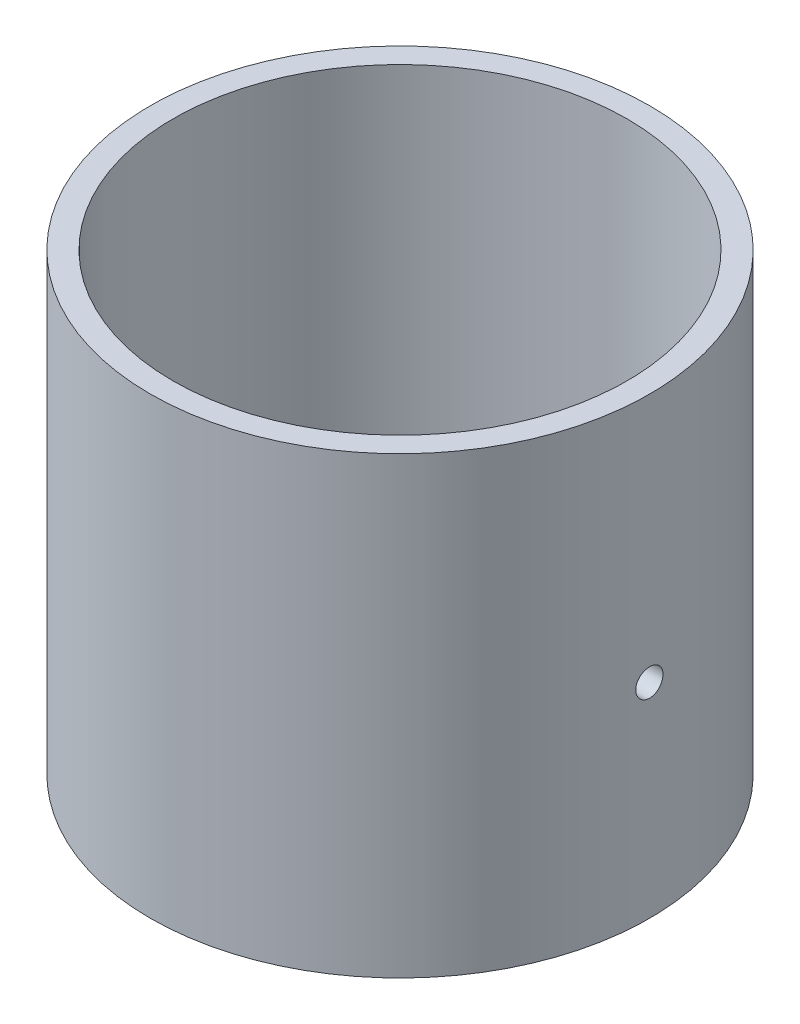
ISO-10303-21;
HEADER;
FILE_DESCRIPTION(('STEP AP214'),'2;1');
FILE_NAME('part.step','',(''),(''),'','','');
FILE_SCHEMA(('AUTOMOTIVE_DESIGN { 1 0 10303 214 1 1 1 1 }'));
ENDSEC;
DATA;
#1=APPLICATION_CONTEXT('core data for automotive mechanical design processes');
#2=APPLICATION_PROTOCOL_DEFINITION('international standard','automotive_design',2000,#1);
#3=PRODUCT_CONTEXT('',#1,'mechanical');
#4=PRODUCT('Part','Part','',(#3));
#5=PRODUCT_RELATED_PRODUCT_CATEGORY('part','',(#4));
#6=PRODUCT_DEFINITION_FORMATION('','',#4);
#7=PRODUCT_DEFINITION_CONTEXT('part definition',#1,'design');
#8=PRODUCT_DEFINITION('design','',#6,#7);
#9=PRODUCT_DEFINITION_SHAPE('','',#8);
#10=(LENGTH_UNIT() NAMED_UNIT(*) SI_UNIT(.MILLI.,.METRE.));
#11=(NAMED_UNIT(*) PLANE_ANGLE_UNIT() SI_UNIT($,.RADIAN.));
#12=(NAMED_UNIT(*) SI_UNIT($,.STERADIAN.) SOLID_ANGLE_UNIT());
#13=UNCERTAINTY_MEASURE_WITH_UNIT(LENGTH_MEASURE(1.E-05),#10,'distance_accuracy_value','');
#14=(GEOMETRIC_REPRESENTATION_CONTEXT(3) GLOBAL_UNCERTAINTY_ASSIGNED_CONTEXT((#13)) GLOBAL_UNIT_ASSIGNED_CONTEXT((#10,
#11,#12)) REPRESENTATION_CONTEXT('',''));
#15=CARTESIAN_POINT('',(0.,0.,0.));
#16=DIRECTION('',(0.,0.,1.));
#17=DIRECTION('',(1.,0.,0.));
#18=AXIS2_PLACEMENT_3D('',#15,#16,#17);
#19=CARTESIAN_POINT('',(17.2756766467066,79.0743076923077,0.));
#20=DIRECTION('',(0.,-1.,0.));
#21=DIRECTION('',(0.,0.,-1.));
#22=AXIS2_PLACEMENT_3D('',#19,#20,#21);
#23=PLANE('',#22);
#24=CARTESIAN_POINT('',(17.2756766467066,79.0743076923077,0.));
#25=DIRECTION('',(0.,1.,0.));
#26=DIRECTION('',(0.,0.,1.));
#27=AXIS2_PLACEMENT_3D('',#24,#25,#26);
#28=CIRCLE('',#27,50.);
#29=CARTESIAN_POINT('',(17.2756766467066,79.0743076923077,50.));
#30=VERTEX_POINT('',#29);
#31=EDGE_CURVE('E57',#30,#30,#28,.T.);
#32=ORIENTED_EDGE('',*,*,#31,.F.);
#33=EDGE_LOOP('',(#32));
#34=FACE_BOUND('',#33,.T.);
#35=CARTESIAN_POINT('',(17.2756766467066,79.0743076923077,0.));
#36=DIRECTION('',(0.,-1.,0.));
#37=DIRECTION('',(0.,0.,-1.));
#38=AXIS2_PLACEMENT_3D('',#35,#36,#37);
#39=CIRCLE('',#38,55.);
#40=CARTESIAN_POINT('',(17.2756766467066,79.0743076923077,-55.));
#41=VERTEX_POINT('',#40);
#42=EDGE_CURVE('E10',#41,#41,#39,.T.);
#43=ORIENTED_EDGE('',*,*,#42,.F.);
#44=EDGE_LOOP('',(#43));
#45=FACE_BOUND('',#44,.T.);
#46=ADVANCED_FACE('F40',(#34,#45),#23,.F.);
#47=CARTESIAN_POINT('',(17.2756766467066,-20.9256923076923,0.));
#48=DIRECTION('',(0.,-1.,0.));
#49=DIRECTION('',(0.,0.,-1.));
#50=AXIS2_PLACEMENT_3D('',#47,#48,#49);
#51=CYLINDRICAL_SURFACE('',#50,55.);
#52=CARTESIAN_POINT('',(72.1937975176905,24.0743076923077,-3.));
#53=CARTESIAN_POINT('',(72.1937986160789,23.9059309109595,-2.99999257620985));
#54=CARTESIAN_POINT('',(72.1945801969636,23.7374352315981,-2.98577701071855));
#55=CARTESIAN_POINT('',(72.1976225574519,23.4050935633971,-2.92927073924333));
#56=CARTESIAN_POINT('',(72.1998850727335,23.2412532661284,-2.8869470892997));
#57=CARTESIAN_POINT('',(72.2056322610726,22.9230846640937,-2.77544136472266));
#58=CARTESIAN_POINT('',(72.2091163035504,22.7687514997691,-2.70627314589127));
#59=CARTESIAN_POINT('',(72.2169131716819,22.4739275400449,-2.54306337972707));
#60=CARTESIAN_POINT('',(72.2212258036204,22.3334335207955,-2.44902764421664));
#61=CARTESIAN_POINT('',(72.2301996893931,22.0700691070461,-2.23862960286198));
#62=CARTESIAN_POINT('',(72.2348612992398,21.947217093408,-2.1222443022169));
#63=CARTESIAN_POINT('',(72.244004534305,21.7227809558415,-1.87049745795912));
#64=CARTESIAN_POINT('',(72.2484861521167,21.6211977064113,-1.73513513445859));
#65=CARTESIAN_POINT('',(72.2567672632636,21.4421298720307,-1.4491776545403));
#66=CARTESIAN_POINT('',(72.260566341499,21.3646599312199,-1.29857331484201));
#67=CARTESIAN_POINT('',(72.2670506197092,21.2361116990724,-0.986471471945922));
#68=CARTESIAN_POINT('',(72.2697358292931,21.1850331800618,-0.824974062734187));
#69=CARTESIAN_POINT('',(72.2736873773289,21.1107671754883,-0.49584245153538));
#70=CARTESIAN_POINT('',(72.2749551389176,21.0875517133229,-0.328214579607726));
#71=CARTESIAN_POINT('',(72.2759337129707,21.0695844649505,0.00856333218424759));
#72=CARTESIAN_POINT('',(72.2756445394788,21.0748324220033,0.177713358304984));
#73=CARTESIAN_POINT('',(72.2735430235174,21.1136198761938,0.512544575084419));
#74=CARTESIAN_POINT('',(72.2717323018887,21.1471292677653,0.678229264807286));
#75=CARTESIAN_POINT('',(72.2667934787066,21.2414416967431,1.00161843019289));
#76=CARTESIAN_POINT('',(72.2636653708602,21.3022448645332,1.15932286772952));
#77=CARTESIAN_POINT('',(72.2564412914667,21.449453114206,1.46237172212925));
#78=CARTESIAN_POINT('',(72.252344802541,21.5358718880705,1.60770947517773));
#79=CARTESIAN_POINT('',(72.2436451876577,21.7318482534837,1.88182654358918));
#80=CARTESIAN_POINT('',(72.2390420574044,21.8414060412254,2.01060571853892));
#81=CARTESIAN_POINT('',(72.2298403517781,22.0807206292715,2.24812568843558));
#82=CARTESIAN_POINT('',(72.2252417901467,22.2105035524907,2.35684016536143));
#83=CARTESIAN_POINT('',(72.216573668547,22.4864926655939,2.55094193343204));
#84=CARTESIAN_POINT('',(72.2125041087405,22.6326988605006,2.63632921744264));
#85=CARTESIAN_POINT('',(72.2053533851898,22.9374004314548,2.78135061435912));
#86=CARTESIAN_POINT('',(72.2022722609707,23.0958962986202,2.84098369745329));
#87=CARTESIAN_POINT('',(72.1974473461215,23.4206707587574,2.93278615053778));
#88=CARTESIAN_POINT('',(72.19570354352,23.5869492820462,2.96495576637599));
#89=CARTESIAN_POINT('',(72.1937521472005,23.9223396555652,3.00088547698439));
#90=CARTESIAN_POINT('',(72.1935425772585,24.0914475796017,3.00468211872368));
#91=CARTESIAN_POINT('',(72.1946781193068,24.427898019131,2.98385352100845));
#92=CARTESIAN_POINT('',(72.1960232251608,24.5952405415892,2.9592283937331));
#93=CARTESIAN_POINT('',(72.2001147157406,24.9233070469084,2.882285602369));
#94=CARTESIAN_POINT('',(72.2028602521937,25.0840349727639,2.82998470140614));
#95=CARTESIAN_POINT('',(72.2094424520855,25.3944313557261,2.69919196237784));
#96=CARTESIAN_POINT('',(72.2132791230527,25.5440997365166,2.62069994360159));
#97=CARTESIAN_POINT('',(72.2216159916299,25.8282965450431,2.43965940709638));
#98=CARTESIAN_POINT('',(72.2261168640481,25.9628093271384,2.33708636041902));
#99=CARTESIAN_POINT('',(72.2352725003774,26.2127191567603,2.11083122996261));
#100=CARTESIAN_POINT('',(72.2399272654486,26.3281160601523,1.98714898703335));
#101=CARTESIAN_POINT('',(72.2488718625253,26.5366414670501,1.72202926719911));
#102=CARTESIAN_POINT('',(72.2531613043488,26.6297463491436,1.5805731963306));
#103=CARTESIAN_POINT('',(72.2608862728507,26.7908832747847,1.28401505688928));
#104=CARTESIAN_POINT('',(72.2643218037723,26.8589154429197,1.12891305612838));
#105=CARTESIAN_POINT('',(72.2699499270062,26.9679345245356,0.809553356092037));
#106=CARTESIAN_POINT('',(72.2721432111929,27.0089364946866,0.645300809354751));
#107=CARTESIAN_POINT('',(72.2750424289373,27.0627805812496,0.312230576177715));
#108=CARTESIAN_POINT('',(72.2757483729948,27.0756228964549,0.143412921973885));
#109=CARTESIAN_POINT('',(72.2755933981236,27.0727812426082,-0.193761200088987));
#110=CARTESIAN_POINT('',(72.2747345127149,27.0571342958102,-0.362117982156689));
#111=CARTESIAN_POINT('',(72.2715505512588,26.9978348886578,-0.693810420230382));
#112=CARTESIAN_POINT('',(72.2692254725055,26.9541823766196,-0.857146066969366));
#113=CARTESIAN_POINT('',(72.2633706245722,26.840118851051,-1.17416665182318));
#114=CARTESIAN_POINT('',(72.2598408516431,26.7697077542467,-1.32785155990279));
#115=CARTESIAN_POINT('',(72.2519733629214,26.6041316426869,-1.62122185748099));
#116=CARTESIAN_POINT('',(72.2476356706284,26.5089673478799,-1.76090765398111));
#117=CARTESIAN_POINT('',(72.2386339188405,26.2964517647777,-2.02250074080179));
#118=CARTESIAN_POINT('',(72.2339694777457,26.1790742528038,-2.14438671324422));
#119=CARTESIAN_POINT('',(72.2248427337097,25.9254892861442,-2.36676327315103));
#120=CARTESIAN_POINT('',(72.2203804806927,25.7892772141005,-2.46724859878056));
#121=CARTESIAN_POINT('',(72.212157981628,25.5017662312674,-2.6440277526252));
#122=CARTESIAN_POINT('',(72.2083984805257,25.3504515687536,-2.72029596887062));
#123=CARTESIAN_POINT('',(72.2020169599812,25.0372564460919,-2.84625271998239));
#124=CARTESIAN_POINT('',(72.1993936014785,24.8753886842798,-2.89597256102342));
#125=CARTESIAN_POINT('',(72.1962728137348,24.6061515873274,-2.95441966722104));
#126=CARTESIAN_POINT('',(72.1953486897238,24.5005249915998,-2.97149037509782));
#127=CARTESIAN_POINT('',(72.194110693356,24.2880508009638,-2.9942828921542));
#128=CARTESIAN_POINT('',(72.1937968203688,24.1812032073171,-3.00000471305999));
#129=CARTESIAN_POINT('',(72.1937975176905,24.0743076923077,-3.));
#130=B_SPLINE_CURVE_WITH_KNOTS('',3,(#52,#53,#54,#55,#56,#57,#58,#59,#60,#61,#62,#63,#64,#65,
#66,#67,#68,#69,#70,#71,#72,#73,#74,#75,#76,#77,#78,#79,#80,#81,#82,#83,#84,#85,#86,#87,#88,#89,
#90,#91,#92,#93,#94,#95,#96,#97,#98,#99,#100,#101,#102,#103,#104,#105,#106,#107,#108,#109,#110,
#111,#112,#113,#114,#115,#116,#117,#118,#119,#120,#121,#122,#123,#124,#125,#126,#127,#128,#129),
.UNSPECIFIED.,.T.,.F.,(4,2,2,2,2,2,2,2,2,2,2,2,2,2,2,2,2,2,2,2,2,2,2,2,2,2,2,2,2,2,2,2,2,2,2,2,
2,2,4),(0.,0.504740125735356,1.01007287645611,1.51514514623307,2.02009947901996,
2.52557615512194,3.03107361060214,3.53687746106698,4.04267694798413,4.54796814819847,
5.05325479068965,5.55800385413926,6.0627553288288,6.56777708988322,7.072803133133,
7.57848696180919,8.08417094513846,8.58987514695881,9.09557482176087,9.60062299696719,
10.1056691787829,10.6104098053321,11.1151539145112,11.6204144042499,12.1256787035067,
12.6314760523567,13.137270887845,13.6427837411092,14.1482930256909,14.6531458616296,
15.1579996292687,15.6628549680454,16.1676956247083,16.6731360283937,17.1787005629704,
17.6847980143728,18.1902973439469,18.5107364864619,18.8311752978847),.UNSPECIFIED.);
#131=CARTESIAN_POINT('',(72.1937975176905,24.0743076923077,-3.));
#132=VERTEX_POINT('',#131);
#133=EDGE_CURVE('E56',#132,#132,#130,.T.);
#134=ORIENTED_EDGE('',*,*,#133,.T.);
#135=EDGE_LOOP('',(#134));
#136=FACE_BOUND('',#135,.T.);
#137=CARTESIAN_POINT('',(17.2756766467066,-20.9256923076923,0.));
#138=DIRECTION('',(0.,-1.,0.));
#139=DIRECTION('',(0.,0.,-1.));
#140=AXIS2_PLACEMENT_3D('',#137,#138,#139);
#141=CIRCLE('',#140,55.);
#142=CARTESIAN_POINT('',(17.2756766467066,-20.9256923076923,-55.));
#143=VERTEX_POINT('',#142);
#144=EDGE_CURVE('E47',#143,#143,#141,.T.);
#145=ORIENTED_EDGE('',*,*,#144,.F.);
#146=EDGE_LOOP('',(#145));
#147=FACE_BOUND('',#146,.T.);
#148=ORIENTED_EDGE('',*,*,#42,.T.);
#149=EDGE_LOOP('',(#148));
#150=FACE_BOUND('',#149,.T.);
#151=ADVANCED_FACE('F69',(#136,#147,#150),#51,.T.);
#152=CARTESIAN_POINT('',(-37.7243233532934,-20.9256923076923,0.));
#153=DIRECTION('',(0.,1.,0.));
#154=DIRECTION('',(0.,0.,1.));
#155=AXIS2_PLACEMENT_3D('',#152,#153,#154);
#156=PLANE('',#155);
#157=ORIENTED_EDGE('',*,*,#144,.T.);
#158=EDGE_LOOP('',(#157));
#159=FACE_BOUND('',#158,.T.);
#160=ADVANCED_FACE('F84',(#159),#156,.F.);
#161=CARTESIAN_POINT('',(17.2756766467066,-15.9256923076923,0.));
#162=DIRECTION('',(0.,1.,0.));
#163=DIRECTION('',(0.,0.,1.));
#164=AXIS2_PLACEMENT_3D('',#161,#162,#163);
#165=CYLINDRICAL_SURFACE('',#164,50.);
#166=CARTESIAN_POINT('',(67.1855955005777,24.0743076923077,-3.));
#167=CARTESIAN_POINT('',(67.1855967067699,24.2426562073156,-2.99999258735707));
#168=CARTESIAN_POINT('',(67.1864564306329,24.411122929348,-2.98578177447834));
#169=CARTESIAN_POINT('',(67.1898028793857,24.7434055397311,-2.92929548415804));
#170=CARTESIAN_POINT('',(67.1922915030531,24.9072157672823,-2.88698725324678));
#171=CARTESIAN_POINT('',(67.1986128522829,25.2253240737311,-2.77552488995124));
#172=CARTESIAN_POINT('',(67.2024448735481,25.3796270871917,-2.70638482254646));
#173=CARTESIAN_POINT('',(67.211020344482,25.6743967068131,-2.54324392374023));
#174=CARTESIAN_POINT('',(67.2157635839811,25.8148664922847,-2.44924882319397));
#175=CARTESIAN_POINT('',(67.2256345411378,26.078219026206,-2.23892176408543));
#176=CARTESIAN_POINT('',(67.2307627244576,26.2010799334476,-2.12256247754005));
#177=CARTESIAN_POINT('',(67.2408213930223,26.4255403541285,-1.87086613571391));
#178=CARTESIAN_POINT('',(67.245751870053,26.5271389849043,-1.73552829296344));
#179=CARTESIAN_POINT('',(67.2548634883772,26.7062563743949,-1.44959535041679));
#180=CARTESIAN_POINT('',(67.259044074106,26.7837573110066,-1.29898906707195));
#181=CARTESIAN_POINT('',(67.266179980918,26.9123651761891,-0.986872903133916));
#182=CARTESIAN_POINT('',(67.2691353142784,26.9634723692328,-0.825363131815119));
#183=CARTESIAN_POINT('',(67.2734845182431,27.0377820835228,-0.496232865556631));
#184=CARTESIAN_POINT('',(67.2748802828985,27.0610184556004,-0.328620038744659));
#185=CARTESIAN_POINT('',(67.2759594475432,27.079031454172,0.00813239348194863));
#186=CARTESIAN_POINT('',(67.275642865566,27.0738083803835,0.177271982798924));
#187=CARTESIAN_POINT('',(67.2733345935598,27.0350787102226,0.512047418202574));
#188=CARTESIAN_POINT('',(67.2713450604284,27.0016085319918,0.677687494381371));
#189=CARTESIAN_POINT('',(67.2659173822488,26.9073912496337,1.00099401164866));
#190=CARTESIAN_POINT('',(67.2624792291756,26.8466439943963,1.15866040855898));
#191=CARTESIAN_POINT('',(67.2545377486589,26.6995556493681,1.46166097965742));
#192=CARTESIAN_POINT('',(67.2500337339205,26.6131980362285,1.60698711402266));
#193=CARTESIAN_POINT('',(67.2404674930523,26.4173523819116,1.88109406743768));
#194=CARTESIAN_POINT('',(67.2354052611504,26.3078641015433,2.00987471537073));
#195=CARTESIAN_POINT('',(67.2252829653109,26.0686593581222,2.24744760953885));
#196=CARTESIAN_POINT('',(67.2202229173626,25.938911288478,2.35620803529859));
#197=CARTESIAN_POINT('',(67.2106834401343,25.6629808376006,2.55040788067333));
#198=CARTESIAN_POINT('',(67.2062040110666,25.516798450358,2.6358472917606));
#199=CARTESIAN_POINT('',(67.1983315554279,25.212128942228,2.78097741848751));
#200=CARTESIAN_POINT('',(67.1949385840891,25.0536411962829,2.84066682512985));
#201=CARTESIAN_POINT('',(67.1896236745517,24.7288689991186,2.93258076589739));
#202=CARTESIAN_POINT('',(67.1877017204108,24.5625846324169,2.96480559767351));
#203=CARTESIAN_POINT('',(67.1855485674084,24.2272168807695,3.00083606245594));
#204=CARTESIAN_POINT('',(67.1853147379019,24.0581382625194,3.00468591307));
#205=CARTESIAN_POINT('',(67.186557332331,23.7217376112246,2.98397263230762));
#206=CARTESIAN_POINT('',(67.1880337480749,23.5544155697702,2.95940963702078));
#207=CARTESIAN_POINT('',(67.1925280429342,23.2264025905222,2.8826046361301));
#208=CARTESIAN_POINT('',(67.1955447893978,23.0657068738974,2.83038296773509));
#209=CARTESIAN_POINT('',(67.2027788085629,22.7553606677882,2.69976359803358));
#210=CARTESIAN_POINT('',(67.2069960912974,22.6057102706217,2.62136567797357));
#211=CARTESIAN_POINT('',(67.2161623009713,22.3214995494125,2.4405061331126));
#212=CARTESIAN_POINT('',(67.2211121264237,22.186958119111,2.33801486404898));
#213=CARTESIAN_POINT('',(67.231182451171,21.9369747384233,2.11192115304356));
#214=CARTESIAN_POINT('',(67.2363029520103,21.8215329609088,1.9883185200426));
#215=CARTESIAN_POINT('',(67.2461452810719,21.6128766641425,1.72332048471518));
#216=CARTESIAN_POINT('',(67.2508665912934,21.5196907472139,1.58190253941367));
#217=CARTESIAN_POINT('',(67.2593710815002,21.3583870594731,1.28540170667706));
#218=CARTESIAN_POINT('',(67.2631542669032,21.2902691438944,1.13031889816233));
#219=CARTESIAN_POINT('',(67.2693537334078,21.1810848852843,0.810995995212358));
#220=CARTESIAN_POINT('',(67.2717709312061,21.1400003974186,0.64676212344267));
#221=CARTESIAN_POINT('',(67.2749696988619,21.0859898423627,0.313712443524318));
#222=CARTESIAN_POINT('',(67.2757512833159,21.0730635238846,0.144896676278835));
#223=CARTESIAN_POINT('',(67.2755908027782,21.0757386519891,-0.192241466492347));
#224=CARTESIAN_POINT('',(67.2746514436455,21.0912953144384,-0.360564200493611));
#225=CARTESIAN_POINT('',(67.2711601008729,21.1504020132889,-0.692203138100699));
#226=CARTESIAN_POINT('',(67.2686081143487,21.1939520997609,-0.855519332750974));
#227=CARTESIAN_POINT('',(67.2621784173795,21.3077994955611,-1.17251650153881));
#228=CARTESIAN_POINT('',(67.2583007115299,21.3780967121742,-1.32619750907319));
#229=CARTESIAN_POINT('',(67.2496551104427,21.5434364041662,-1.61958098916875));
#230=CARTESIAN_POINT('',(67.2448872392156,21.6384782121327,-1.75928383860883));
#231=CARTESIAN_POINT('',(67.2349888418008,21.8507738635642,-2.02097192252031));
#232=CARTESIAN_POINT('',(67.2298577970078,21.968059889499,-2.14293102826392));
#233=CARTESIAN_POINT('',(67.2198153909031,22.221475081416,-2.36547027124281));
#234=CARTESIAN_POINT('',(67.2149040837246,22.3576088571599,-2.46604516304507));
#235=CARTESIAN_POINT('',(67.205850709492,22.6450001822598,-2.64302952266152));
#236=CARTESIAN_POINT('',(67.2017095564524,22.7962753781198,-2.71941035171418));
#237=CARTESIAN_POINT('',(67.1946771835529,23.1094169320167,-2.84559604482191));
#238=CARTESIAN_POINT('',(67.1917844977755,23.2712706104267,-2.89543209325468));
#239=CARTESIAN_POINT('',(67.1883361030503,23.5408161988436,-2.95413467297801));
#240=CARTESIAN_POINT('',(67.1873129565523,23.6467649620448,-2.97131199106155));
#241=CARTESIAN_POINT('',(67.1859422716023,23.8598957294622,-2.99424700805968));
#242=CARTESIAN_POINT('',(67.1855947322909,23.9670777321096,-3.00000472149936));
#243=CARTESIAN_POINT('',(67.1855955005777,24.0743076923077,-3.));
#244=B_SPLINE_CURVE_WITH_KNOTS('',3,(#166,#167,#168,#169,#170,#171,#172,#173,#174,#175,#176,
#177,#178,#179,#180,#181,#182,#183,#184,#185,#186,#187,#188,#189,#190,#191,#192,#193,#194,#195,
#196,#197,#198,#199,#200,#201,#202,#203,#204,#205,#206,#207,#208,#209,#210,#211,#212,#213,#214,
#215,#216,#217,#218,#219,#220,#221,#222,#223,#224,#225,#226,#227,#228,#229,#230,#231,#232,#233,
#234,#235,#236,#237,#238,#239,#240,#241,#242,#243),.UNSPECIFIED.,.T.,.F.,(4,2,2,2,2,2,2,2,2,2,2,
2,2,2,2,2,2,2,2,2,2,2,2,2,2,2,2,2,2,2,2,2,2,2,2,2,2,2,4),(0.,0.504654094410829,1.00989750469077,
1.51487642839874,2.01973901987436,2.52522249762361,3.03072695540781,3.53660438832691,
4.04247675211105,4.54773407852321,5.05298608388373,5.55758767641759,6.06219206439061,
6.56712272507958,7.07205860744166,7.5777902413209,8.08352206012946,8.58927958470434,
9.09503162799609,9.59999537532427,10.1049567040272,10.6095472529766,11.1141420188672,
11.619360913985,12.1245843816075,12.630453689427,13.1363200758288,13.6418465774614,
14.147368567676,14.6520964020586,15.1568251392307,15.6615521268506,16.1662655023595,
16.6717147352076,17.1772878093688,17.6834571183417,18.1890304689197,18.5104714230321,
18.8319119682899),.UNSPECIFIED.);
#245=CARTESIAN_POINT('',(67.1855955005777,24.0743076923077,-3.));
#246=VERTEX_POINT('',#245);
#247=EDGE_CURVE('E37',#246,#246,#244,.T.);
#248=ORIENTED_EDGE('',*,*,#247,.T.);
#249=EDGE_LOOP('',(#248));
#250=FACE_BOUND('',#249,.T.);
#251=CARTESIAN_POINT('',(17.2756766467066,-15.9256923076923,0.));
#252=DIRECTION('',(0.,1.,0.));
#253=DIRECTION('',(0.,0.,1.));
#254=AXIS2_PLACEMENT_3D('',#251,#252,#253);
#255=CIRCLE('',#254,50.);
#256=CARTESIAN_POINT('',(17.2756766467066,-15.9256923076923,50.));
#257=VERTEX_POINT('',#256);
#258=EDGE_CURVE('E52',#257,#257,#255,.T.);
#259=ORIENTED_EDGE('',*,*,#258,.F.);
#260=EDGE_LOOP('',(#259));
#261=FACE_BOUND('',#260,.T.);
#262=ORIENTED_EDGE('',*,*,#31,.T.);
#263=EDGE_LOOP('',(#262));
#264=FACE_BOUND('',#263,.T.);
#265=ADVANCED_FACE('F76',(#250,#261,#264),#165,.F.);
#266=CARTESIAN_POINT('',(17.2756766467066,-15.9256923076923,0.));
#267=DIRECTION('',(0.,1.,0.));
#268=DIRECTION('',(0.,0.,1.));
#269=AXIS2_PLACEMENT_3D('',#266,#267,#268);
#270=PLANE('',#269);
#271=ORIENTED_EDGE('',*,*,#258,.T.);
#272=EDGE_LOOP('',(#271));
#273=FACE_BOUND('',#272,.T.);
#274=ADVANCED_FACE('F71',(#273),#270,.T.);
#275=CARTESIAN_POINT('',(26.,24.0743076923077,0.));
#276=DIRECTION('',(1.,0.,0.));
#277=DIRECTION('',(0.,0.,-1.));
#278=AXIS2_PLACEMENT_3D('',#275,#276,#277);
#279=CYLINDRICAL_SURFACE('',#278,3.);
#280=ORIENTED_EDGE('',*,*,#247,.F.);
#281=EDGE_LOOP('',(#280));
#282=FACE_BOUND('',#281,.T.);
#283=ORIENTED_EDGE('',*,*,#133,.F.);
#284=EDGE_LOOP('',(#283));
#285=FACE_BOUND('',#284,.T.);
#286=ADVANCED_FACE('F68',(#282,#285),#279,.F.);
#287=CLOSED_SHELL('',(#46,#151,#160,#265,#274,#286));
#288=MANIFOLD_SOLID_BREP('B2',#287);
#289=ADVANCED_BREP_SHAPE_REPRESENTATION('',(#18,#288),#14);
#290=SHAPE_DEFINITION_REPRESENTATION(#9,#289);
ENDSEC;
END-ISO-10303-21;
